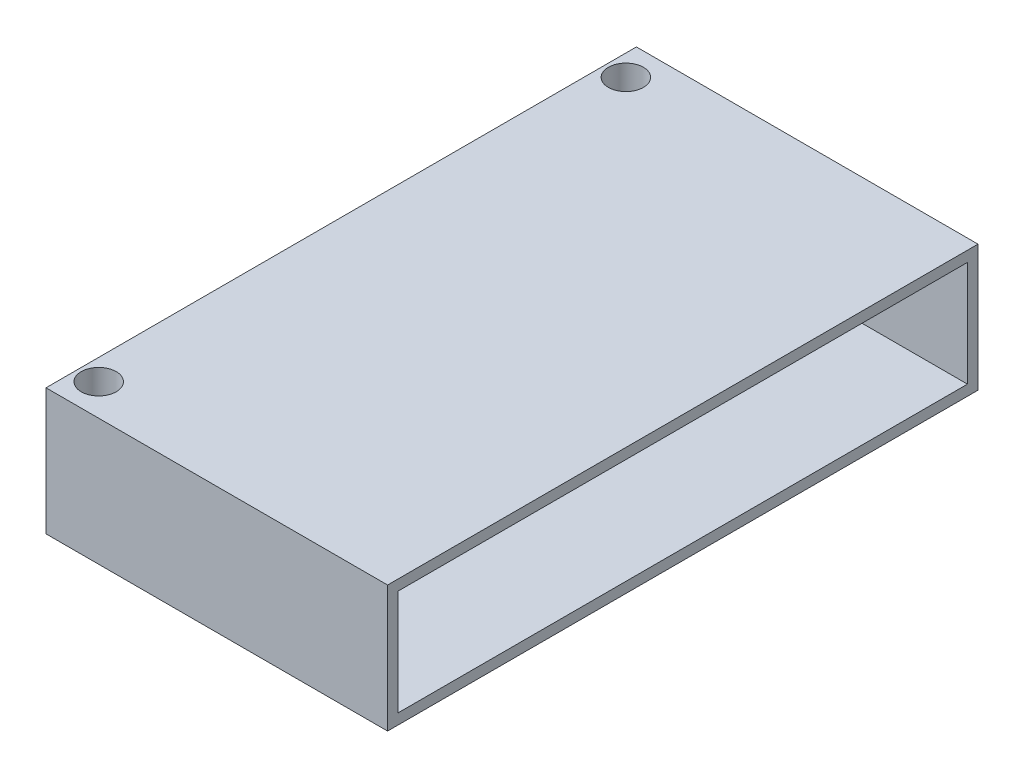
ISO-10303-21;
HEADER;
FILE_DESCRIPTION(('STEP AP214'),'2;1');
FILE_NAME('part.step','',(''),(''),'','','');
FILE_SCHEMA(('AUTOMOTIVE_DESIGN { 1 0 10303 214 1 1 1 1 }'));
ENDSEC;
DATA;
#1=APPLICATION_CONTEXT('core data for automotive mechanical design processes');
#2=APPLICATION_PROTOCOL_DEFINITION('international standard','automotive_design',2000,#1);
#3=PRODUCT_CONTEXT('',#1,'mechanical');
#4=PRODUCT('Part','Part','',(#3));
#5=PRODUCT_RELATED_PRODUCT_CATEGORY('part','',(#4));
#6=PRODUCT_DEFINITION_FORMATION('','',#4);
#7=PRODUCT_DEFINITION_CONTEXT('part definition',#1,'design');
#8=PRODUCT_DEFINITION('design','',#6,#7);
#9=PRODUCT_DEFINITION_SHAPE('','',#8);
#10=(LENGTH_UNIT() NAMED_UNIT(*) SI_UNIT(.MILLI.,.METRE.));
#11=(NAMED_UNIT(*) PLANE_ANGLE_UNIT() SI_UNIT($,.RADIAN.));
#12=(NAMED_UNIT(*) SI_UNIT($,.STERADIAN.) SOLID_ANGLE_UNIT());
#13=UNCERTAINTY_MEASURE_WITH_UNIT(LENGTH_MEASURE(1.E-05),#10,'distance_accuracy_value','');
#14=(GEOMETRIC_REPRESENTATION_CONTEXT(3) GLOBAL_UNCERTAINTY_ASSIGNED_CONTEXT((#13)) GLOBAL_UNIT_ASSIGNED_CONTEXT((#10,
#11,#12)) REPRESENTATION_CONTEXT('',''));
#15=CARTESIAN_POINT('',(0.,0.,0.));
#16=DIRECTION('',(0.,0.,1.));
#17=DIRECTION('',(1.,0.,0.));
#18=AXIS2_PLACEMENT_3D('',#15,#16,#17);
#19=CARTESIAN_POINT('',(1.,30.,0.));
#20=DIRECTION('',(1.,0.,0.));
#21=DIRECTION('',(0.,0.,-1.));
#22=AXIS2_PLACEMENT_3D('',#19,#20,#21);
#23=PLANE('',#22);
#24=DIRECTION('',(0.,0.,1.));
#25=VECTOR('',#24,1.);
#26=CARTESIAN_POINT('',(1.,0.,0.));
#27=LINE('',#26,#25);
#28=CARTESIAN_POINT('',(1.,0.,-140.));
#29=VERTEX_POINT('',#28);
#30=CARTESIAN_POINT('',(1.,0.,0.));
#31=VERTEX_POINT('',#30);
#32=EDGE_CURVE('E251',#29,#31,#27,.T.);
#33=ORIENTED_EDGE('',*,*,#32,.F.);
#34=DIRECTION('',(0.,-1.,0.));
#35=VECTOR('',#34,1.);
#36=CARTESIAN_POINT('',(1.,30.,-140.));
#37=LINE('',#36,#35);
#38=CARTESIAN_POINT('',(1.,30.,-140.));
#39=VERTEX_POINT('',#38);
#40=EDGE_CURVE('E93',#39,#29,#37,.T.);
#41=ORIENTED_EDGE('',*,*,#40,.F.);
#42=DIRECTION('',(0.,0.,1.));
#43=VECTOR('',#42,1.);
#44=CARTESIAN_POINT('',(1.,30.,0.));
#45=LINE('',#44,#43);
#46=CARTESIAN_POINT('',(1.,30.,0.));
#47=VERTEX_POINT('',#46);
#48=EDGE_CURVE('E256',#39,#47,#45,.T.);
#49=ORIENTED_EDGE('',*,*,#48,.T.);
#50=DIRECTION('',(0.,-1.,0.));
#51=VECTOR('',#50,1.);
#52=CARTESIAN_POINT('',(1.,30.,0.));
#53=LINE('',#52,#51);
#54=EDGE_CURVE('E268',#47,#31,#53,.T.);
#55=ORIENTED_EDGE('',*,*,#54,.T.);
#56=EDGE_LOOP('',(#33,#41,#49,#55));
#57=FACE_BOUND('',#56,.T.);
#58=DIRECTION('',(0.,-1.,0.));
#59=VECTOR('',#58,1.);
#60=CARTESIAN_POINT('',(1.,30.,-137.5));
#61=LINE('',#60,#59);
#62=CARTESIAN_POINT('',(1.,27.5,-137.5));
#63=VERTEX_POINT('',#62);
#64=CARTESIAN_POINT('',(1.,2.5,-137.5));
#65=VERTEX_POINT('',#64);
#66=EDGE_CURVE('E216',#63,#65,#61,.T.);
#67=ORIENTED_EDGE('',*,*,#66,.T.);
#68=DIRECTION('',(0.,0.,1.));
#69=VECTOR('',#68,1.);
#70=CARTESIAN_POINT('',(1.,2.5,0.));
#71=LINE('',#70,#69);
#72=CARTESIAN_POINT('',(1.,2.5,-2.5));
#73=VERTEX_POINT('',#72);
#74=EDGE_CURVE('E191',#65,#73,#71,.T.);
#75=ORIENTED_EDGE('',*,*,#74,.T.);
#76=DIRECTION('',(0.,-1.,0.));
#77=VECTOR('',#76,1.);
#78=CARTESIAN_POINT('',(1.,30.,-2.5));
#79=LINE('',#78,#77);
#80=CARTESIAN_POINT('',(1.,27.5,-2.5));
#81=VERTEX_POINT('',#80);
#82=EDGE_CURVE('E214',#81,#73,#79,.T.);
#83=ORIENTED_EDGE('',*,*,#82,.F.);
#84=DIRECTION('',(0.,0.,1.));
#85=VECTOR('',#84,1.);
#86=CARTESIAN_POINT('',(1.,27.5,0.));
#87=LINE('',#86,#85);
#88=EDGE_CURVE('E84',#63,#81,#87,.T.);
#89=ORIENTED_EDGE('',*,*,#88,.F.);
#90=EDGE_LOOP('',(#67,#75,#83,#89));
#91=FACE_BOUND('',#90,.T.);
#92=ADVANCED_FACE('F69',(#57,#91),#23,.T.);
#93=CARTESIAN_POINT('',(-80.,30.,0.));
#94=DIRECTION('',(1.,0.,0.));
#95=DIRECTION('',(0.,0.,-1.));
#96=AXIS2_PLACEMENT_3D('',#93,#94,#95);
#97=PLANE('',#96);
#98=DIRECTION('',(0.,0.,1.));
#99=VECTOR('',#98,1.);
#100=CARTESIAN_POINT('',(-80.,0.,0.));
#101=LINE('',#100,#99);
#102=CARTESIAN_POINT('',(-80.,0.,-140.));
#103=VERTEX_POINT('',#102);
#104=CARTESIAN_POINT('',(-80.,0.,0.));
#105=VERTEX_POINT('',#104);
#106=EDGE_CURVE('E259',#103,#105,#101,.T.);
#107=ORIENTED_EDGE('',*,*,#106,.T.);
#108=DIRECTION('',(0.,-1.,0.));
#109=VECTOR('',#108,1.);
#110=CARTESIAN_POINT('',(-80.,30.,0.));
#111=LINE('',#110,#109);
#112=CARTESIAN_POINT('',(-80.,30.,0.));
#113=VERTEX_POINT('',#112);
#114=EDGE_CURVE('E77',#113,#105,#111,.T.);
#115=ORIENTED_EDGE('',*,*,#114,.F.);
#116=DIRECTION('',(0.,0.,1.));
#117=VECTOR('',#116,1.);
#118=CARTESIAN_POINT('',(-80.,30.,0.));
#119=LINE('',#118,#117);
#120=CARTESIAN_POINT('',(-80.,30.,-140.));
#121=VERTEX_POINT('',#120);
#122=EDGE_CURVE('E119',#121,#113,#119,.T.);
#123=ORIENTED_EDGE('',*,*,#122,.F.);
#124=DIRECTION('',(0.,-1.,0.));
#125=VECTOR('',#124,1.);
#126=CARTESIAN_POINT('',(-80.,30.,-140.));
#127=LINE('',#126,#125);
#128=EDGE_CURVE('E12',#121,#103,#127,.T.);
#129=ORIENTED_EDGE('',*,*,#128,.T.);
#130=EDGE_LOOP('',(#107,#115,#123,#129));
#131=FACE_BOUND('',#130,.T.);
#132=ADVANCED_FACE('F273',(#131),#97,.F.);
#133=CARTESIAN_POINT('',(0.,30.,0.));
#134=DIRECTION('',(0.,0.,1.));
#135=DIRECTION('',(1.,0.,0.));
#136=AXIS2_PLACEMENT_3D('',#133,#134,#135);
#137=PLANE('',#136);
#138=DIRECTION('',(-1.,0.,0.));
#139=VECTOR('',#138,1.);
#140=CARTESIAN_POINT('',(0.,0.,0.));
#141=LINE('',#140,#139);
#142=EDGE_CURVE('E262',#31,#105,#141,.T.);
#143=ORIENTED_EDGE('',*,*,#142,.F.);
#144=ORIENTED_EDGE('',*,*,#54,.F.);
#145=DIRECTION('',(-1.,0.,0.));
#146=VECTOR('',#145,1.);
#147=CARTESIAN_POINT('',(0.,30.,0.));
#148=LINE('',#147,#146);
#149=EDGE_CURVE('E253',#47,#113,#148,.T.);
#150=ORIENTED_EDGE('',*,*,#149,.T.);
#151=ORIENTED_EDGE('',*,*,#114,.T.);
#152=EDGE_LOOP('',(#143,#144,#150,#151));
#153=FACE_BOUND('',#152,.T.);
#154=ADVANCED_FACE('F271',(#153),#137,.T.);
#155=CARTESIAN_POINT('',(0.,30.,-140.));
#156=DIRECTION('',(0.,0.,1.));
#157=DIRECTION('',(1.,0.,0.));
#158=AXIS2_PLACEMENT_3D('',#155,#156,#157);
#159=PLANE('',#158);
#160=DIRECTION('',(-1.,0.,0.));
#161=VECTOR('',#160,1.);
#162=CARTESIAN_POINT('',(0.,0.,-140.));
#163=LINE('',#162,#161);
#164=EDGE_CURVE('E240',#29,#103,#163,.T.);
#165=ORIENTED_EDGE('',*,*,#164,.T.);
#166=ORIENTED_EDGE('',*,*,#128,.F.);
#167=DIRECTION('',(-1.,0.,0.));
#168=VECTOR('',#167,1.);
#169=CARTESIAN_POINT('',(0.,30.,-140.));
#170=LINE('',#169,#168);
#171=EDGE_CURVE('E249',#39,#121,#170,.T.);
#172=ORIENTED_EDGE('',*,*,#171,.F.);
#173=ORIENTED_EDGE('',*,*,#40,.T.);
#174=EDGE_LOOP('',(#165,#166,#172,#173));
#175=FACE_BOUND('',#174,.T.);
#176=ADVANCED_FACE('F71',(#175),#159,.F.);
#177=CARTESIAN_POINT('',(0.,0.,0.));
#178=DIRECTION('',(0.,1.,0.));
#179=DIRECTION('',(0.,0.,1.));
#180=AXIS2_PLACEMENT_3D('',#177,#178,#179);
#181=PLANE('',#180);
#182=ORIENTED_EDGE('',*,*,#164,.F.);
#183=ORIENTED_EDGE('',*,*,#32,.T.);
#184=ORIENTED_EDGE('',*,*,#142,.T.);
#185=ORIENTED_EDGE('',*,*,#106,.F.);
#186=EDGE_LOOP('',(#182,#183,#184,#185));
#187=FACE_BOUND('',#186,.T.);
#188=ADVANCED_FACE('F276',(#187),#181,.F.);
#189=CARTESIAN_POINT('',(0.,30.,0.));
#190=DIRECTION('',(0.,1.,0.));
#191=DIRECTION('',(0.,0.,1.));
#192=AXIS2_PLACEMENT_3D('',#189,#190,#191);
#193=PLANE('',#192);
#194=CARTESIAN_POINT('',(-75.,30.,-132.5));
#195=DIRECTION('',(0.,1.,0.));
#196=DIRECTION('',(0.,0.,1.));
#197=AXIS2_PLACEMENT_3D('',#194,#195,#196);
#198=CIRCLE('',#197,4.14999999999999);
#199=CARTESIAN_POINT('',(-75.,30.,-128.35));
#200=VERTEX_POINT('',#199);
#201=EDGE_CURVE('E241',#200,#200,#198,.T.);
#202=ORIENTED_EDGE('',*,*,#201,.F.);
#203=EDGE_LOOP('',(#202));
#204=FACE_BOUND('',#203,.T.);
#205=CARTESIAN_POINT('',(-75.,30.,-7.49999999999999));
#206=DIRECTION('',(0.,1.,0.));
#207=DIRECTION('',(0.,0.,1.));
#208=AXIS2_PLACEMENT_3D('',#205,#206,#207);
#209=CIRCLE('',#208,4.15);
#210=CARTESIAN_POINT('',(-75.,30.,-3.34999999999999));
#211=VERTEX_POINT('',#210);
#212=EDGE_CURVE('E236',#211,#211,#209,.T.);
#213=ORIENTED_EDGE('',*,*,#212,.F.);
#214=EDGE_LOOP('',(#213));
#215=FACE_BOUND('',#214,.T.);
#216=ORIENTED_EDGE('',*,*,#171,.T.);
#217=ORIENTED_EDGE('',*,*,#122,.T.);
#218=ORIENTED_EDGE('',*,*,#149,.F.);
#219=ORIENTED_EDGE('',*,*,#48,.F.);
#220=EDGE_LOOP('',(#216,#217,#218,#219));
#221=FACE_BOUND('',#220,.T.);
#222=ADVANCED_FACE('F280',(#204,#215,#221),#193,.T.);
#223=CARTESIAN_POINT('',(-75.,23.,-7.49999999999999));
#224=DIRECTION('',(0.,1.,0.));
#225=DIRECTION('',(0.,0.,1.));
#226=AXIS2_PLACEMENT_3D('',#223,#224,#225);
#227=CYLINDRICAL_SURFACE('',#226,4.15);
#228=CARTESIAN_POINT('',(-75.,23.,-7.49999999999999));
#229=DIRECTION('',(0.,1.,0.));
#230=DIRECTION('',(0.,0.,1.));
#231=AXIS2_PLACEMENT_3D('',#228,#229,#230);
#232=CIRCLE('',#231,4.15);
#233=CARTESIAN_POINT('',(-75.,23.,-3.34999999999999));
#234=VERTEX_POINT('',#233);
#235=EDGE_CURVE('E244',#234,#234,#232,.T.);
#236=ORIENTED_EDGE('',*,*,#235,.F.);
#237=EDGE_LOOP('',(#236));
#238=FACE_BOUND('',#237,.T.);
#239=ORIENTED_EDGE('',*,*,#212,.T.);
#240=EDGE_LOOP('',(#239));
#241=FACE_BOUND('',#240,.T.);
#242=ADVANCED_FACE('F296',(#238,#241),#227,.F.);
#243=CARTESIAN_POINT('',(0.,23.,0.));
#244=DIRECTION('',(0.,1.,0.));
#245=DIRECTION('',(0.,0.,1.));
#246=AXIS2_PLACEMENT_3D('',#243,#244,#245);
#247=PLANE('',#246);
#248=ORIENTED_EDGE('',*,*,#235,.T.);
#249=EDGE_LOOP('',(#248));
#250=FACE_BOUND('',#249,.T.);
#251=ADVANCED_FACE('F300',(#250),#247,.T.);
#252=CARTESIAN_POINT('',(-75.,23.,-132.5));
#253=DIRECTION('',(0.,1.,0.));
#254=DIRECTION('',(0.,0.,1.));
#255=AXIS2_PLACEMENT_3D('',#252,#253,#254);
#256=CYLINDRICAL_SURFACE('',#255,4.14999999999999);
#257=CARTESIAN_POINT('',(-75.,23.,-132.5));
#258=DIRECTION('',(0.,1.,0.));
#259=DIRECTION('',(0.,0.,1.));
#260=AXIS2_PLACEMENT_3D('',#257,#258,#259);
#261=CIRCLE('',#260,4.14999999999999);
#262=CARTESIAN_POINT('',(-75.,23.,-128.35));
#263=VERTEX_POINT('',#262);
#264=EDGE_CURVE('E237',#263,#263,#261,.T.);
#265=ORIENTED_EDGE('',*,*,#264,.F.);
#266=EDGE_LOOP('',(#265));
#267=FACE_BOUND('',#266,.T.);
#268=ORIENTED_EDGE('',*,*,#201,.T.);
#269=EDGE_LOOP('',(#268));
#270=FACE_BOUND('',#269,.T.);
#271=ADVANCED_FACE('F304',(#267,#270),#256,.F.);
#272=CARTESIAN_POINT('',(0.,23.,0.));
#273=DIRECTION('',(0.,1.,0.));
#274=DIRECTION('',(0.,0.,1.));
#275=AXIS2_PLACEMENT_3D('',#272,#273,#274);
#276=PLANE('',#275);
#277=ORIENTED_EDGE('',*,*,#264,.T.);
#278=EDGE_LOOP('',(#277));
#279=FACE_BOUND('',#278,.T.);
#280=ADVANCED_FACE('F308',(#279),#276,.T.);
#281=CARTESIAN_POINT('',(0.,30.,-137.5));
#282=DIRECTION('',(0.,0.,1.));
#283=DIRECTION('',(1.,0.,0.));
#284=AXIS2_PLACEMENT_3D('',#281,#282,#283);
#285=PLANE('',#284);
#286=DIRECTION('',(-1.,0.,0.));
#287=VECTOR('',#286,1.);
#288=CARTESIAN_POINT('',(0.,20.5,-137.5));
#289=LINE('',#288,#287);
#290=CARTESIAN_POINT('',(-70.6156528422124,20.5,-137.5));
#291=VERTEX_POINT('',#290);
#292=CARTESIAN_POINT('',(-77.5,20.5,-137.5));
#293=VERTEX_POINT('',#292);
#294=EDGE_CURVE('E174',#291,#293,#289,.T.);
#295=ORIENTED_EDGE('',*,*,#294,.T.);
#296=DIRECTION('',(0.,-1.,0.));
#297=VECTOR('',#296,1.);
#298=CARTESIAN_POINT('',(-77.5,30.,-137.5));
#299=LINE('',#298,#297);
#300=CARTESIAN_POINT('',(-77.5,2.5,-137.5));
#301=VERTEX_POINT('',#300);
#302=EDGE_CURVE('E167',#293,#301,#299,.T.);
#303=ORIENTED_EDGE('',*,*,#302,.T.);
#304=DIRECTION('',(-1.,0.,0.));
#305=VECTOR('',#304,1.);
#306=CARTESIAN_POINT('',(0.,2.5,-137.5));
#307=LINE('',#306,#305);
#308=EDGE_CURVE('E171',#65,#301,#307,.T.);
#309=ORIENTED_EDGE('',*,*,#308,.F.);
#310=ORIENTED_EDGE('',*,*,#66,.F.);
#311=DIRECTION('',(-1.,0.,0.));
#312=VECTOR('',#311,1.);
#313=CARTESIAN_POINT('',(0.,27.5,-137.5));
#314=LINE('',#313,#312);
#315=CARTESIAN_POINT('',(-70.6156528422124,27.5,-137.5));
#316=VERTEX_POINT('',#315);
#317=EDGE_CURVE('E202',#63,#316,#314,.T.);
#318=ORIENTED_EDGE('',*,*,#317,.T.);
#319=DIRECTION('',(0.,1.,0.));
#320=VECTOR('',#319,1.);
#321=CARTESIAN_POINT('',(-70.6156528422124,23.,-137.5));
#322=LINE('',#321,#320);
#323=EDGE_CURVE('E224',#316,#291,#322,.F.);
#324=ORIENTED_EDGE('',*,*,#323,.T.);
#325=EDGE_LOOP('',(#295,#303,#309,#310,#318,#324));
#326=FACE_BOUND('',#325,.T.);
#327=ADVANCED_FACE('F169',(#326),#285,.T.);
#328=CARTESIAN_POINT('',(0.,30.,-2.5));
#329=DIRECTION('',(0.,0.,1.));
#330=DIRECTION('',(1.,0.,0.));
#331=AXIS2_PLACEMENT_3D('',#328,#329,#330);
#332=PLANE('',#331);
#333=DIRECTION('',(1.,0.,0.));
#334=VECTOR('',#333,1.);
#335=CARTESIAN_POINT('',(0.,20.5,-2.5));
#336=LINE('',#335,#334);
#337=CARTESIAN_POINT('',(-77.5,20.5,-2.49999999999999));
#338=VERTEX_POINT('',#337);
#339=CARTESIAN_POINT('',(-70.6156528422124,20.5,-2.49999999999999));
#340=VERTEX_POINT('',#339);
#341=EDGE_CURVE('E231',#338,#340,#336,.T.);
#342=ORIENTED_EDGE('',*,*,#341,.T.);
#343=DIRECTION('',(0.,1.,0.));
#344=VECTOR('',#343,1.);
#345=CARTESIAN_POINT('',(-70.6156528422124,23.,-2.49999999999999));
#346=LINE('',#345,#344);
#347=CARTESIAN_POINT('',(-70.6156528422124,27.5,-2.49999999999999));
#348=VERTEX_POINT('',#347);
#349=EDGE_CURVE('E222',#340,#348,#346,.T.);
#350=ORIENTED_EDGE('',*,*,#349,.T.);
#351=DIRECTION('',(-1.,0.,0.));
#352=VECTOR('',#351,1.);
#353=CARTESIAN_POINT('',(0.,27.5,-2.5));
#354=LINE('',#353,#352);
#355=EDGE_CURVE('E200',#81,#348,#354,.T.);
#356=ORIENTED_EDGE('',*,*,#355,.F.);
#357=ORIENTED_EDGE('',*,*,#82,.T.);
#358=DIRECTION('',(-1.,0.,0.));
#359=VECTOR('',#358,1.);
#360=CARTESIAN_POINT('',(0.,2.5,-2.5));
#361=LINE('',#360,#359);
#362=CARTESIAN_POINT('',(-77.5,2.5,-2.49999999999999));
#363=VERTEX_POINT('',#362);
#364=EDGE_CURVE('E187',#73,#363,#361,.T.);
#365=ORIENTED_EDGE('',*,*,#364,.T.);
#366=DIRECTION('',(0.,-1.,0.));
#367=VECTOR('',#366,1.);
#368=CARTESIAN_POINT('',(-77.5,30.,-2.49999999999999));
#369=LINE('',#368,#367);
#370=EDGE_CURVE('E178',#338,#363,#369,.T.);
#371=ORIENTED_EDGE('',*,*,#370,.F.);
#372=EDGE_LOOP('',(#342,#350,#356,#357,#365,#371));
#373=FACE_BOUND('',#372,.T.);
#374=ADVANCED_FACE('F336',(#373),#332,.F.);
#375=CARTESIAN_POINT('',(-77.5,30.,0.));
#376=DIRECTION('',(1.,0.,0.));
#377=DIRECTION('',(0.,0.,-1.));
#378=AXIS2_PLACEMENT_3D('',#375,#376,#377);
#379=PLANE('',#378);
#380=DIRECTION('',(0.,1.,0.));
#381=VECTOR('',#380,1.);
#382=CARTESIAN_POINT('',(-77.5,23.,-126.33781694527));
#383=LINE('',#382,#381);
#384=CARTESIAN_POINT('',(-77.5,27.5,-126.33781694527));
#385=VERTEX_POINT('',#384);
#386=CARTESIAN_POINT('',(-77.5,20.5,-126.33781694527));
#387=VERTEX_POINT('',#386);
#388=EDGE_CURVE('E226',#385,#387,#383,.F.);
#389=ORIENTED_EDGE('',*,*,#388,.F.);
#390=DIRECTION('',(0.,0.,1.));
#391=VECTOR('',#390,1.);
#392=CARTESIAN_POINT('',(-77.5,27.5,0.));
#393=LINE('',#392,#391);
#394=CARTESIAN_POINT('',(-77.5,27.5,-13.6621830547299));
#395=VERTEX_POINT('',#394);
#396=EDGE_CURVE('E205',#385,#395,#393,.T.);
#397=ORIENTED_EDGE('',*,*,#396,.T.);
#398=DIRECTION('',(0.,1.,0.));
#399=VECTOR('',#398,1.);
#400=CARTESIAN_POINT('',(-77.5,23.,-13.6621830547299));
#401=LINE('',#400,#399);
#402=CARTESIAN_POINT('',(-77.5,20.5,-13.6621830547299));
#403=VERTEX_POINT('',#402);
#404=EDGE_CURVE('E177',#395,#403,#401,.F.);
#405=ORIENTED_EDGE('',*,*,#404,.T.);
#406=DIRECTION('',(0.,0.,1.));
#407=VECTOR('',#406,1.);
#408=CARTESIAN_POINT('',(-77.5,20.5,0.));
#409=LINE('',#408,#407);
#410=EDGE_CURVE('E229',#403,#338,#409,.T.);
#411=ORIENTED_EDGE('',*,*,#410,.T.);
#412=ORIENTED_EDGE('',*,*,#370,.T.);
#413=DIRECTION('',(0.,0.,1.));
#414=VECTOR('',#413,1.);
#415=CARTESIAN_POINT('',(-77.5,2.5,0.));
#416=LINE('',#415,#414);
#417=EDGE_CURVE('E181',#301,#363,#416,.T.);
#418=ORIENTED_EDGE('',*,*,#417,.F.);
#419=ORIENTED_EDGE('',*,*,#302,.F.);
#420=DIRECTION('',(0.,0.,-1.));
#421=VECTOR('',#420,1.);
#422=CARTESIAN_POINT('',(-77.5,20.5,0.));
#423=LINE('',#422,#421);
#424=EDGE_CURVE('E234',#387,#293,#423,.T.);
#425=ORIENTED_EDGE('',*,*,#424,.F.);
#426=EDGE_LOOP('',(#389,#397,#405,#411,#412,#418,#419,#425));
#427=FACE_BOUND('',#426,.T.);
#428=ADVANCED_FACE('F182',(#427),#379,.T.);
#429=CARTESIAN_POINT('',(0.,2.5,0.));
#430=DIRECTION('',(0.,1.,0.));
#431=DIRECTION('',(0.,0.,1.));
#432=AXIS2_PLACEMENT_3D('',#429,#430,#431);
#433=PLANE('',#432);
#434=ORIENTED_EDGE('',*,*,#308,.T.);
#435=ORIENTED_EDGE('',*,*,#417,.T.);
#436=ORIENTED_EDGE('',*,*,#364,.F.);
#437=ORIENTED_EDGE('',*,*,#74,.F.);
#438=EDGE_LOOP('',(#434,#435,#436,#437));
#439=FACE_BOUND('',#438,.T.);
#440=ADVANCED_FACE('F189',(#439),#433,.T.);
#441=CARTESIAN_POINT('',(0.,27.5,0.));
#442=DIRECTION('',(0.,1.,0.));
#443=DIRECTION('',(0.,0.,1.));
#444=AXIS2_PLACEMENT_3D('',#441,#442,#443);
#445=PLANE('',#444);
#446=ORIENTED_EDGE('',*,*,#396,.F.);
#447=CARTESIAN_POINT('',(-75.,27.5,-132.5));
#448=DIRECTION('',(0.,1.,0.));
#449=DIRECTION('',(0.,0.,1.));
#450=AXIS2_PLACEMENT_3D('',#447,#448,#449);
#451=CIRCLE('',#450,6.64999999999999);
#452=EDGE_CURVE('E196',#385,#316,#451,.T.);
#453=ORIENTED_EDGE('',*,*,#452,.T.);
#454=ORIENTED_EDGE('',*,*,#317,.F.);
#455=ORIENTED_EDGE('',*,*,#88,.T.);
#456=ORIENTED_EDGE('',*,*,#355,.T.);
#457=CARTESIAN_POINT('',(-75.,27.5,-7.49999999999999));
#458=DIRECTION('',(0.,1.,0.));
#459=DIRECTION('',(0.,0.,1.));
#460=AXIS2_PLACEMENT_3D('',#457,#458,#459);
#461=CIRCLE('',#460,6.65);
#462=EDGE_CURVE('E209',#348,#395,#461,.T.);
#463=ORIENTED_EDGE('',*,*,#462,.T.);
#464=EDGE_LOOP('',(#446,#453,#454,#455,#456,#463));
#465=FACE_BOUND('',#464,.T.);
#466=ADVANCED_FACE('F328',(#465),#445,.F.);
#467=CARTESIAN_POINT('',(-75.,23.,-7.49999999999999));
#468=DIRECTION('',(0.,1.,0.));
#469=DIRECTION('',(0.,0.,1.));
#470=AXIS2_PLACEMENT_3D('',#467,#468,#469);
#471=CYLINDRICAL_SURFACE('',#470,6.65);
#472=CARTESIAN_POINT('',(-75.,20.5,-7.49999999999999));
#473=DIRECTION('',(0.,1.,0.));
#474=DIRECTION('',(0.,0.,1.));
#475=AXIS2_PLACEMENT_3D('',#472,#473,#474);
#476=CIRCLE('',#475,6.65);
#477=EDGE_CURVE('E208',#340,#403,#476,.T.);
#478=ORIENTED_EDGE('',*,*,#477,.T.);
#479=ORIENTED_EDGE('',*,*,#404,.F.);
#480=ORIENTED_EDGE('',*,*,#462,.F.);
#481=ORIENTED_EDGE('',*,*,#349,.F.);
#482=EDGE_LOOP('',(#478,#479,#480,#481));
#483=FACE_BOUND('',#482,.T.);
#484=ADVANCED_FACE('F324',(#483),#471,.T.);
#485=CARTESIAN_POINT('',(0.,20.5,0.));
#486=DIRECTION('',(0.,1.,0.));
#487=DIRECTION('',(0.,0.,1.));
#488=AXIS2_PLACEMENT_3D('',#485,#486,#487);
#489=PLANE('',#488);
#490=ORIENTED_EDGE('',*,*,#410,.F.);
#491=ORIENTED_EDGE('',*,*,#477,.F.);
#492=ORIENTED_EDGE('',*,*,#341,.F.);
#493=EDGE_LOOP('',(#490,#491,#492));
#494=FACE_BOUND('',#493,.T.);
#495=ADVANCED_FACE('F320',(#494),#489,.F.);
#496=CARTESIAN_POINT('',(-75.,23.,-132.5));
#497=DIRECTION('',(0.,1.,0.));
#498=DIRECTION('',(0.,0.,1.));
#499=AXIS2_PLACEMENT_3D('',#496,#497,#498);
#500=CYLINDRICAL_SURFACE('',#499,6.64999999999999);
#501=ORIENTED_EDGE('',*,*,#388,.T.);
#502=CARTESIAN_POINT('',(-75.,20.5,-132.5));
#503=DIRECTION('',(0.,1.,0.));
#504=DIRECTION('',(0.,0.,1.));
#505=AXIS2_PLACEMENT_3D('',#502,#503,#504);
#506=CIRCLE('',#505,6.64999999999999);
#507=EDGE_CURVE('E193',#387,#291,#506,.T.);
#508=ORIENTED_EDGE('',*,*,#507,.T.);
#509=ORIENTED_EDGE('',*,*,#323,.F.);
#510=ORIENTED_EDGE('',*,*,#452,.F.);
#511=EDGE_LOOP('',(#501,#508,#509,#510));
#512=FACE_BOUND('',#511,.T.);
#513=ADVANCED_FACE('F316',(#512),#500,.T.);
#514=CARTESIAN_POINT('',(0.,20.5,0.));
#515=DIRECTION('',(0.,1.,0.));
#516=DIRECTION('',(0.,0.,1.));
#517=AXIS2_PLACEMENT_3D('',#514,#515,#516);
#518=PLANE('',#517);
#519=ORIENTED_EDGE('',*,*,#424,.T.);
#520=ORIENTED_EDGE('',*,*,#294,.F.);
#521=ORIENTED_EDGE('',*,*,#507,.F.);
#522=EDGE_LOOP('',(#519,#520,#521));
#523=FACE_BOUND('',#522,.T.);
#524=ADVANCED_FACE('F313',(#523),#518,.F.);
#525=CLOSED_SHELL('',(#92,#132,#154,#176,#188,#222,#242,#251,#271,#280,#327,#374,#428,#440,#466,
#484,#495,#513,#524));
#526=MANIFOLD_SOLID_BREP('B2',#525);
#527=ADVANCED_BREP_SHAPE_REPRESENTATION('',(#18,#526),#14);
#528=SHAPE_DEFINITION_REPRESENTATION(#9,#527);
ENDSEC;
END-ISO-10303-21;
